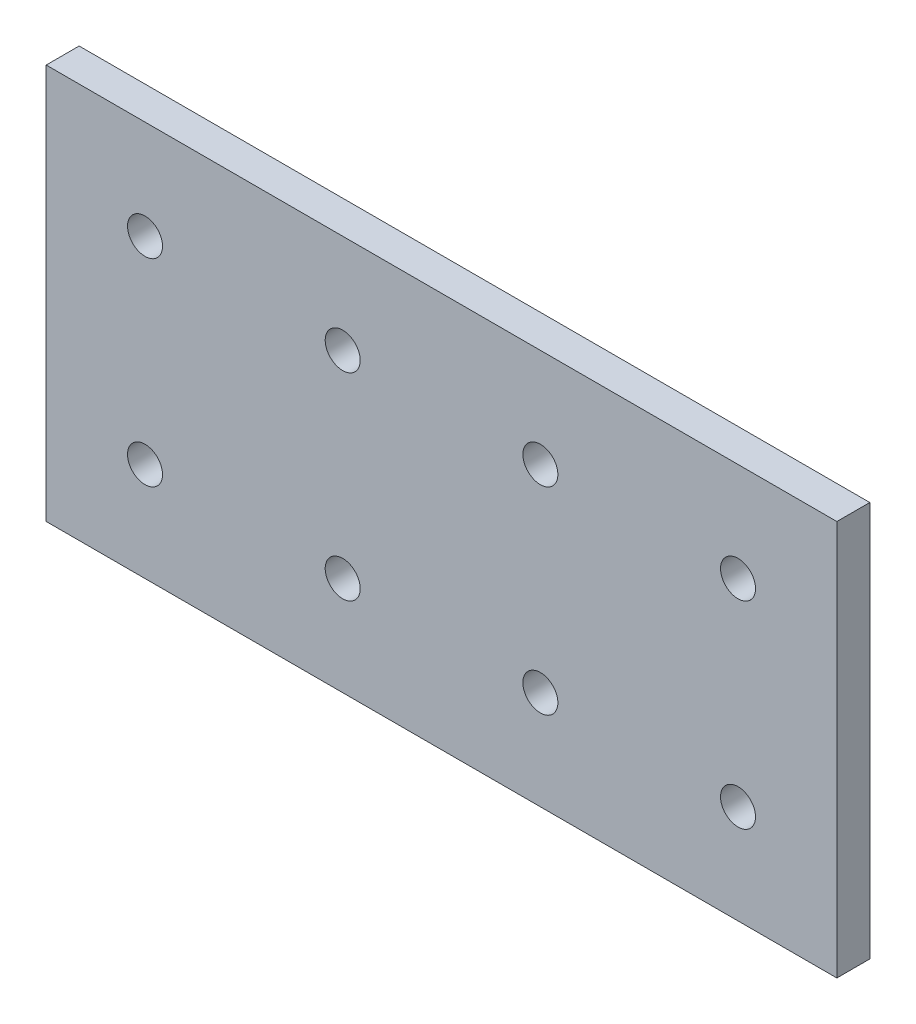
ISO-10303-21;
HEADER;
FILE_DESCRIPTION(('STEP AP214'),'2;1');
FILE_NAME('part.step','',(''),(''),'','','');
FILE_SCHEMA(('AUTOMOTIVE_DESIGN { 1 0 10303 214 1 1 1 1 }'));
ENDSEC;
DATA;
#1=APPLICATION_CONTEXT('core data for automotive mechanical design processes');
#2=APPLICATION_PROTOCOL_DEFINITION('international standard','automotive_design',2000,#1);
#3=PRODUCT_CONTEXT('',#1,'mechanical');
#4=PRODUCT('Part','Part','',(#3));
#5=PRODUCT_RELATED_PRODUCT_CATEGORY('part','',(#4));
#6=PRODUCT_DEFINITION_FORMATION('','',#4);
#7=PRODUCT_DEFINITION_CONTEXT('part definition',#1,'design');
#8=PRODUCT_DEFINITION('design','',#6,#7);
#9=PRODUCT_DEFINITION_SHAPE('','',#8);
#10=(LENGTH_UNIT() NAMED_UNIT(*) SI_UNIT(.MILLI.,.METRE.));
#11=(NAMED_UNIT(*) PLANE_ANGLE_UNIT() SI_UNIT($,.RADIAN.));
#12=(NAMED_UNIT(*) SI_UNIT($,.STERADIAN.) SOLID_ANGLE_UNIT());
#13=UNCERTAINTY_MEASURE_WITH_UNIT(LENGTH_MEASURE(1.E-05),#10,'distance_accuracy_value','');
#14=(GEOMETRIC_REPRESENTATION_CONTEXT(3) GLOBAL_UNCERTAINTY_ASSIGNED_CONTEXT((#13)) GLOBAL_UNIT_ASSIGNED_CONTEXT((#10,
#11,#12)) REPRESENTATION_CONTEXT('',''));
#15=CARTESIAN_POINT('',(0.,0.,0.));
#16=DIRECTION('',(0.,0.,1.));
#17=DIRECTION('',(1.,0.,0.));
#18=AXIS2_PLACEMENT_3D('',#15,#16,#17);
#19=CARTESIAN_POINT('',(133.35,57.15,6.35));
#20=DIRECTION('',(0.,0.,1.));
#21=DIRECTION('',(1.,0.,0.));
#22=AXIS2_PLACEMENT_3D('',#19,#20,#21);
#23=CYLINDRICAL_SURFACE('',#22,3.373501);
#24=CARTESIAN_POINT('',(133.35,57.15,0.));
#25=DIRECTION('',(0.,0.,1.));
#26=DIRECTION('',(1.,0.,0.));
#27=AXIS2_PLACEMENT_3D('',#24,#25,#26);
#28=CIRCLE('',#27,3.373501);
#29=CARTESIAN_POINT('',(136.723501,57.15,0.));
#30=VERTEX_POINT('',#29);
#31=EDGE_CURVE('E47',#30,#30,#28,.T.);
#32=ORIENTED_EDGE('',*,*,#31,.F.);
#33=EDGE_LOOP('',(#32));
#34=FACE_BOUND('',#33,.T.);
#35=CARTESIAN_POINT('',(133.35,57.15,6.35));
#36=DIRECTION('',(0.,0.,1.));
#37=DIRECTION('',(1.,0.,0.));
#38=AXIS2_PLACEMENT_3D('',#35,#36,#37);
#39=CIRCLE('',#38,3.373501);
#40=CARTESIAN_POINT('',(136.723501,57.15,6.35));
#41=VERTEX_POINT('',#40);
#42=EDGE_CURVE('E11',#41,#41,#39,.T.);
#43=ORIENTED_EDGE('',*,*,#42,.T.);
#44=EDGE_LOOP('',(#43));
#45=FACE_BOUND('',#44,.T.);
#46=ADVANCED_FACE('F39',(#34,#45),#23,.F.);
#47=CARTESIAN_POINT('',(95.25,57.15,6.35));
#48=DIRECTION('',(0.,0.,1.));
#49=DIRECTION('',(1.,0.,0.));
#50=AXIS2_PLACEMENT_3D('',#47,#48,#49);
#51=CYLINDRICAL_SURFACE('',#50,3.373501);
#52=CARTESIAN_POINT('',(95.25,57.15,0.));
#53=DIRECTION('',(0.,0.,1.));
#54=DIRECTION('',(1.,0.,0.));
#55=AXIS2_PLACEMENT_3D('',#52,#53,#54);
#56=CIRCLE('',#55,3.373501);
#57=CARTESIAN_POINT('',(98.623501,57.15,0.));
#58=VERTEX_POINT('',#57);
#59=EDGE_CURVE('E141',#58,#58,#56,.T.);
#60=ORIENTED_EDGE('',*,*,#59,.F.);
#61=EDGE_LOOP('',(#60));
#62=FACE_BOUND('',#61,.T.);
#63=CARTESIAN_POINT('',(95.25,57.15,6.35));
#64=DIRECTION('',(0.,0.,1.));
#65=DIRECTION('',(1.,0.,0.));
#66=AXIS2_PLACEMENT_3D('',#63,#64,#65);
#67=CIRCLE('',#66,3.373501);
#68=CARTESIAN_POINT('',(98.623501,57.15,6.35));
#69=VERTEX_POINT('',#68);
#70=EDGE_CURVE('E144',#69,#69,#67,.T.);
#71=ORIENTED_EDGE('',*,*,#70,.T.);
#72=EDGE_LOOP('',(#71));
#73=FACE_BOUND('',#72,.T.);
#74=ADVANCED_FACE('F153',(#62,#73),#51,.F.);
#75=CARTESIAN_POINT('',(57.15,57.15,6.35));
#76=DIRECTION('',(0.,0.,1.));
#77=DIRECTION('',(1.,0.,0.));
#78=AXIS2_PLACEMENT_3D('',#75,#76,#77);
#79=CYLINDRICAL_SURFACE('',#78,3.373501);
#80=CARTESIAN_POINT('',(57.15,57.15,0.));
#81=DIRECTION('',(0.,0.,1.));
#82=DIRECTION('',(1.,0.,0.));
#83=AXIS2_PLACEMENT_3D('',#80,#81,#82);
#84=CIRCLE('',#83,3.373501);
#85=CARTESIAN_POINT('',(60.523501,57.15,0.));
#86=VERTEX_POINT('',#85);
#87=EDGE_CURVE('E135',#86,#86,#84,.T.);
#88=ORIENTED_EDGE('',*,*,#87,.F.);
#89=EDGE_LOOP('',(#88));
#90=FACE_BOUND('',#89,.T.);
#91=CARTESIAN_POINT('',(57.15,57.15,6.35));
#92=DIRECTION('',(0.,0.,1.));
#93=DIRECTION('',(1.,0.,0.));
#94=AXIS2_PLACEMENT_3D('',#91,#92,#93);
#95=CIRCLE('',#94,3.373501);
#96=CARTESIAN_POINT('',(60.523501,57.15,6.35));
#97=VERTEX_POINT('',#96);
#98=EDGE_CURVE('E138',#97,#97,#95,.T.);
#99=ORIENTED_EDGE('',*,*,#98,.T.);
#100=EDGE_LOOP('',(#99));
#101=FACE_BOUND('',#100,.T.);
#102=ADVANCED_FACE('F192',(#90,#101),#79,.F.);
#103=CARTESIAN_POINT('',(19.05,57.15,6.35));
#104=DIRECTION('',(0.,0.,1.));
#105=DIRECTION('',(1.,0.,0.));
#106=AXIS2_PLACEMENT_3D('',#103,#104,#105);
#107=CYLINDRICAL_SURFACE('',#106,3.373501);
#108=CARTESIAN_POINT('',(19.05,57.15,0.));
#109=DIRECTION('',(0.,0.,1.));
#110=DIRECTION('',(1.,0.,0.));
#111=AXIS2_PLACEMENT_3D('',#108,#109,#110);
#112=CIRCLE('',#111,3.373501);
#113=CARTESIAN_POINT('',(22.423501,57.15,0.));
#114=VERTEX_POINT('',#113);
#115=EDGE_CURVE('E129',#114,#114,#112,.T.);
#116=ORIENTED_EDGE('',*,*,#115,.F.);
#117=EDGE_LOOP('',(#116));
#118=FACE_BOUND('',#117,.T.);
#119=CARTESIAN_POINT('',(19.05,57.15,6.35));
#120=DIRECTION('',(0.,0.,1.));
#121=DIRECTION('',(1.,0.,0.));
#122=AXIS2_PLACEMENT_3D('',#119,#120,#121);
#123=CIRCLE('',#122,3.373501);
#124=CARTESIAN_POINT('',(22.423501,57.15,6.35));
#125=VERTEX_POINT('',#124);
#126=EDGE_CURVE('E132',#125,#125,#123,.T.);
#127=ORIENTED_EDGE('',*,*,#126,.T.);
#128=EDGE_LOOP('',(#127));
#129=FACE_BOUND('',#128,.T.);
#130=ADVANCED_FACE('F188',(#118,#129),#107,.F.);
#131=CARTESIAN_POINT('',(133.35,19.05,6.35));
#132=DIRECTION('',(0.,0.,1.));
#133=DIRECTION('',(1.,0.,0.));
#134=AXIS2_PLACEMENT_3D('',#131,#132,#133);
#135=CYLINDRICAL_SURFACE('',#134,3.373501);
#136=CARTESIAN_POINT('',(133.35,19.05,0.));
#137=DIRECTION('',(0.,0.,1.));
#138=DIRECTION('',(1.,0.,0.));
#139=AXIS2_PLACEMENT_3D('',#136,#137,#138);
#140=CIRCLE('',#139,3.373501);
#141=CARTESIAN_POINT('',(136.723501,19.05,0.));
#142=VERTEX_POINT('',#141);
#143=EDGE_CURVE('E123',#142,#142,#140,.T.);
#144=ORIENTED_EDGE('',*,*,#143,.F.);
#145=EDGE_LOOP('',(#144));
#146=FACE_BOUND('',#145,.T.);
#147=CARTESIAN_POINT('',(133.35,19.05,6.35));
#148=DIRECTION('',(0.,0.,1.));
#149=DIRECTION('',(1.,0.,0.));
#150=AXIS2_PLACEMENT_3D('',#147,#148,#149);
#151=CIRCLE('',#150,3.373501);
#152=CARTESIAN_POINT('',(136.723501,19.05,6.35));
#153=VERTEX_POINT('',#152);
#154=EDGE_CURVE('E126',#153,#153,#151,.T.);
#155=ORIENTED_EDGE('',*,*,#154,.T.);
#156=EDGE_LOOP('',(#155));
#157=FACE_BOUND('',#156,.T.);
#158=ADVANCED_FACE('F184',(#146,#157),#135,.F.);
#159=CARTESIAN_POINT('',(95.25,19.05,6.35));
#160=DIRECTION('',(0.,0.,1.));
#161=DIRECTION('',(1.,0.,0.));
#162=AXIS2_PLACEMENT_3D('',#159,#160,#161);
#163=CYLINDRICAL_SURFACE('',#162,3.373501);
#164=CARTESIAN_POINT('',(95.25,19.05,0.));
#165=DIRECTION('',(0.,0.,1.));
#166=DIRECTION('',(1.,0.,0.));
#167=AXIS2_PLACEMENT_3D('',#164,#165,#166);
#168=CIRCLE('',#167,3.373501);
#169=CARTESIAN_POINT('',(98.623501,19.05,0.));
#170=VERTEX_POINT('',#169);
#171=EDGE_CURVE('E117',#170,#170,#168,.T.);
#172=ORIENTED_EDGE('',*,*,#171,.F.);
#173=EDGE_LOOP('',(#172));
#174=FACE_BOUND('',#173,.T.);
#175=CARTESIAN_POINT('',(95.25,19.05,6.35));
#176=DIRECTION('',(0.,0.,1.));
#177=DIRECTION('',(1.,0.,0.));
#178=AXIS2_PLACEMENT_3D('',#175,#176,#177);
#179=CIRCLE('',#178,3.373501);
#180=CARTESIAN_POINT('',(98.623501,19.05,6.35));
#181=VERTEX_POINT('',#180);
#182=EDGE_CURVE('E120',#181,#181,#179,.T.);
#183=ORIENTED_EDGE('',*,*,#182,.T.);
#184=EDGE_LOOP('',(#183));
#185=FACE_BOUND('',#184,.T.);
#186=ADVANCED_FACE('F181',(#174,#185),#163,.F.);
#187=CARTESIAN_POINT('',(0.,76.2,6.35));
#188=DIRECTION('',(1.,0.,0.));
#189=DIRECTION('',(0.,1.,0.));
#190=AXIS2_PLACEMENT_3D('',#187,#188,#189);
#191=PLANE('',#190);
#192=DIRECTION('',(0.,-1.,0.));
#193=VECTOR('',#192,1.);
#194=CARTESIAN_POINT('',(0.,76.2,0.));
#195=LINE('',#194,#193);
#196=CARTESIAN_POINT('',(0.,76.2,0.));
#197=VERTEX_POINT('',#196);
#198=CARTESIAN_POINT('',(0.,0.,0.));
#199=VERTEX_POINT('',#198);
#200=EDGE_CURVE('E107',#197,#199,#195,.T.);
#201=ORIENTED_EDGE('',*,*,#200,.T.);
#202=DIRECTION('',(0.,0.,-1.));
#203=VECTOR('',#202,1.);
#204=CARTESIAN_POINT('',(0.,0.,6.35));
#205=LINE('',#204,#203);
#206=CARTESIAN_POINT('',(0.,0.,6.35));
#207=VERTEX_POINT('',#206);
#208=EDGE_CURVE('E98',#207,#199,#205,.T.);
#209=ORIENTED_EDGE('',*,*,#208,.F.);
#210=DIRECTION('',(0.,-1.,0.));
#211=VECTOR('',#210,1.);
#212=CARTESIAN_POINT('',(0.,76.2,6.35));
#213=LINE('',#212,#211);
#214=CARTESIAN_POINT('',(0.,76.2,6.35));
#215=VERTEX_POINT('',#214);
#216=EDGE_CURVE('E92',#215,#207,#213,.T.);
#217=ORIENTED_EDGE('',*,*,#216,.F.);
#218=DIRECTION('',(0.,0.,-1.));
#219=VECTOR('',#218,1.);
#220=CARTESIAN_POINT('',(0.,76.2,6.35));
#221=LINE('',#220,#219);
#222=EDGE_CURVE('E103',#215,#197,#221,.T.);
#223=ORIENTED_EDGE('',*,*,#222,.T.);
#224=EDGE_LOOP('',(#201,#209,#217,#223));
#225=FACE_BOUND('',#224,.T.);
#226=ADVANCED_FACE('F178',(#225),#191,.F.);
#227=CARTESIAN_POINT('',(0.,0.,6.35));
#228=DIRECTION('',(0.,1.,0.));
#229=DIRECTION('',(0.,0.,1.));
#230=AXIS2_PLACEMENT_3D('',#227,#228,#229);
#231=PLANE('',#230);
#232=DIRECTION('',(1.,0.,0.));
#233=VECTOR('',#232,1.);
#234=CARTESIAN_POINT('',(0.,0.,0.));
#235=LINE('',#234,#233);
#236=CARTESIAN_POINT('',(152.4,0.,0.));
#237=VERTEX_POINT('',#236);
#238=EDGE_CURVE('E97',#199,#237,#235,.T.);
#239=ORIENTED_EDGE('',*,*,#238,.T.);
#240=DIRECTION('',(0.,0.,-1.));
#241=VECTOR('',#240,1.);
#242=CARTESIAN_POINT('',(152.4,0.,6.35));
#243=LINE('',#242,#241);
#244=CARTESIAN_POINT('',(152.4,0.,6.35));
#245=VERTEX_POINT('',#244);
#246=EDGE_CURVE('E95',#245,#237,#243,.T.);
#247=ORIENTED_EDGE('',*,*,#246,.F.);
#248=DIRECTION('',(1.,0.,0.));
#249=VECTOR('',#248,1.);
#250=CARTESIAN_POINT('',(0.,0.,6.35));
#251=LINE('',#250,#249);
#252=EDGE_CURVE('E86',#207,#245,#251,.T.);
#253=ORIENTED_EDGE('',*,*,#252,.F.);
#254=ORIENTED_EDGE('',*,*,#208,.T.);
#255=EDGE_LOOP('',(#239,#247,#253,#254));
#256=FACE_BOUND('',#255,.T.);
#257=ADVANCED_FACE('F96',(#256),#231,.F.);
#258=CARTESIAN_POINT('',(152.4,0.,6.35));
#259=DIRECTION('',(-1.,0.,0.));
#260=DIRECTION('',(0.,0.,1.));
#261=AXIS2_PLACEMENT_3D('',#258,#259,#260);
#262=PLANE('',#261);
#263=DIRECTION('',(0.,1.,0.));
#264=VECTOR('',#263,1.);
#265=CARTESIAN_POINT('',(152.4,0.,0.));
#266=LINE('',#265,#264);
#267=CARTESIAN_POINT('',(152.4,76.2,0.));
#268=VERTEX_POINT('',#267);
#269=EDGE_CURVE('E72',#237,#268,#266,.T.);
#270=ORIENTED_EDGE('',*,*,#269,.T.);
#271=DIRECTION('',(0.,0.,-1.));
#272=VECTOR('',#271,1.);
#273=CARTESIAN_POINT('',(152.4,76.2,6.35));
#274=LINE('',#273,#272);
#275=CARTESIAN_POINT('',(152.4,76.2,6.35));
#276=VERTEX_POINT('',#275);
#277=EDGE_CURVE('E99',#276,#268,#274,.T.);
#278=ORIENTED_EDGE('',*,*,#277,.F.);
#279=DIRECTION('',(0.,1.,0.));
#280=VECTOR('',#279,1.);
#281=CARTESIAN_POINT('',(152.4,0.,6.35));
#282=LINE('',#281,#280);
#283=EDGE_CURVE('E90',#245,#276,#282,.T.);
#284=ORIENTED_EDGE('',*,*,#283,.F.);
#285=ORIENTED_EDGE('',*,*,#246,.T.);
#286=EDGE_LOOP('',(#270,#278,#284,#285));
#287=FACE_BOUND('',#286,.T.);
#288=ADVANCED_FACE('F101',(#287),#262,.F.);
#289=CARTESIAN_POINT('',(152.4,76.2,6.35));
#290=DIRECTION('',(0.,-1.,0.));
#291=DIRECTION('',(1.,0.,0.));
#292=AXIS2_PLACEMENT_3D('',#289,#290,#291);
#293=PLANE('',#292);
#294=DIRECTION('',(-1.,0.,0.));
#295=VECTOR('',#294,1.);
#296=CARTESIAN_POINT('',(152.4,76.2,0.));
#297=LINE('',#296,#295);
#298=EDGE_CURVE('E78',#268,#197,#297,.T.);
#299=ORIENTED_EDGE('',*,*,#298,.T.);
#300=ORIENTED_EDGE('',*,*,#222,.F.);
#301=DIRECTION('',(-1.,0.,0.));
#302=VECTOR('',#301,1.);
#303=CARTESIAN_POINT('',(152.4,76.2,6.35));
#304=LINE('',#303,#302);
#305=EDGE_CURVE('E55',#276,#215,#304,.T.);
#306=ORIENTED_EDGE('',*,*,#305,.F.);
#307=ORIENTED_EDGE('',*,*,#277,.T.);
#308=EDGE_LOOP('',(#299,#300,#306,#307));
#309=FACE_BOUND('',#308,.T.);
#310=ADVANCED_FACE('F157',(#309),#293,.F.);
#311=CARTESIAN_POINT('',(0.,0.,6.35));
#312=DIRECTION('',(0.,0.,1.));
#313=DIRECTION('',(1.,0.,0.));
#314=AXIS2_PLACEMENT_3D('',#311,#312,#313);
#315=PLANE('',#314);
#316=CARTESIAN_POINT('',(57.15,19.05,6.35));
#317=DIRECTION('',(0.,0.,1.));
#318=DIRECTION('',(1.,0.,0.));
#319=AXIS2_PLACEMENT_3D('',#316,#317,#318);
#320=CIRCLE('',#319,3.373501);
#321=CARTESIAN_POINT('',(60.523501,19.05,6.35));
#322=VERTEX_POINT('',#321);
#323=EDGE_CURVE('E268',#322,#322,#320,.T.);
#324=ORIENTED_EDGE('',*,*,#323,.F.);
#325=EDGE_LOOP('',(#324));
#326=FACE_BOUND('',#325,.T.);
#327=CARTESIAN_POINT('',(19.05,19.05,6.35));
#328=DIRECTION('',(0.,0.,1.));
#329=DIRECTION('',(1.,0.,0.));
#330=AXIS2_PLACEMENT_3D('',#327,#328,#329);
#331=CIRCLE('',#330,3.373501);
#332=CARTESIAN_POINT('',(22.423501,19.05,6.35));
#333=VERTEX_POINT('',#332);
#334=EDGE_CURVE('E267',#333,#333,#331,.T.);
#335=ORIENTED_EDGE('',*,*,#334,.F.);
#336=EDGE_LOOP('',(#335));
#337=FACE_BOUND('',#336,.T.);
#338=ORIENTED_EDGE('',*,*,#216,.T.);
#339=ORIENTED_EDGE('',*,*,#252,.T.);
#340=ORIENTED_EDGE('',*,*,#283,.T.);
#341=ORIENTED_EDGE('',*,*,#305,.T.);
#342=EDGE_LOOP('',(#338,#339,#340,#341));
#343=FACE_BOUND('',#342,.T.);
#344=ORIENTED_EDGE('',*,*,#182,.F.);
#345=EDGE_LOOP('',(#344));
#346=FACE_BOUND('',#345,.T.);
#347=ORIENTED_EDGE('',*,*,#154,.F.);
#348=EDGE_LOOP('',(#347));
#349=FACE_BOUND('',#348,.T.);
#350=ORIENTED_EDGE('',*,*,#126,.F.);
#351=EDGE_LOOP('',(#350));
#352=FACE_BOUND('',#351,.T.);
#353=ORIENTED_EDGE('',*,*,#98,.F.);
#354=EDGE_LOOP('',(#353));
#355=FACE_BOUND('',#354,.T.);
#356=ORIENTED_EDGE('',*,*,#70,.F.);
#357=EDGE_LOOP('',(#356));
#358=FACE_BOUND('',#357,.T.);
#359=ORIENTED_EDGE('',*,*,#42,.F.);
#360=EDGE_LOOP('',(#359));
#361=FACE_BOUND('',#360,.T.);
#362=ADVANCED_FACE('F87',(#326,#337,#343,#346,#349,#352,#355,#358,#361),#315,.T.);
#363=CARTESIAN_POINT('',(0.,0.,0.));
#364=DIRECTION('',(0.,0.,1.));
#365=DIRECTION('',(1.,0.,0.));
#366=AXIS2_PLACEMENT_3D('',#363,#364,#365);
#367=PLANE('',#366);
#368=CARTESIAN_POINT('',(57.15,19.05,0.));
#369=DIRECTION('',(0.,0.,1.));
#370=DIRECTION('',(1.,0.,0.));
#371=AXIS2_PLACEMENT_3D('',#368,#369,#370);
#372=CIRCLE('',#371,3.373501);
#373=CARTESIAN_POINT('',(60.523501,19.05,0.));
#374=VERTEX_POINT('',#373);
#375=EDGE_CURVE('E272',#374,#374,#372,.T.);
#376=ORIENTED_EDGE('',*,*,#375,.T.);
#377=EDGE_LOOP('',(#376));
#378=FACE_BOUND('',#377,.T.);
#379=CARTESIAN_POINT('',(19.05,19.05,0.));
#380=DIRECTION('',(0.,0.,1.));
#381=DIRECTION('',(1.,0.,0.));
#382=AXIS2_PLACEMENT_3D('',#379,#380,#381);
#383=CIRCLE('',#382,3.373501);
#384=CARTESIAN_POINT('',(22.423501,19.05,0.));
#385=VERTEX_POINT('',#384);
#386=EDGE_CURVE('E110',#385,#385,#383,.T.);
#387=ORIENTED_EDGE('',*,*,#386,.T.);
#388=EDGE_LOOP('',(#387));
#389=FACE_BOUND('',#388,.T.);
#390=ORIENTED_EDGE('',*,*,#200,.F.);
#391=ORIENTED_EDGE('',*,*,#298,.F.);
#392=ORIENTED_EDGE('',*,*,#269,.F.);
#393=ORIENTED_EDGE('',*,*,#238,.F.);
#394=EDGE_LOOP('',(#390,#391,#392,#393));
#395=FACE_BOUND('',#394,.T.);
#396=ORIENTED_EDGE('',*,*,#171,.T.);
#397=EDGE_LOOP('',(#396));
#398=FACE_BOUND('',#397,.T.);
#399=ORIENTED_EDGE('',*,*,#143,.T.);
#400=EDGE_LOOP('',(#399));
#401=FACE_BOUND('',#400,.T.);
#402=ORIENTED_EDGE('',*,*,#115,.T.);
#403=EDGE_LOOP('',(#402));
#404=FACE_BOUND('',#403,.T.);
#405=ORIENTED_EDGE('',*,*,#87,.T.);
#406=EDGE_LOOP('',(#405));
#407=FACE_BOUND('',#406,.T.);
#408=ORIENTED_EDGE('',*,*,#59,.T.);
#409=EDGE_LOOP('',(#408));
#410=FACE_BOUND('',#409,.T.);
#411=ORIENTED_EDGE('',*,*,#31,.T.);
#412=EDGE_LOOP('',(#411));
#413=FACE_BOUND('',#412,.T.);
#414=ADVANCED_FACE('F149',(#378,#389,#395,#398,#401,#404,#407,#410,#413),#367,.F.);
#415=CARTESIAN_POINT('',(19.05,19.05,6.35));
#416=DIRECTION('',(0.,0.,1.));
#417=DIRECTION('',(1.,0.,0.));
#418=AXIS2_PLACEMENT_3D('',#415,#416,#417);
#419=CYLINDRICAL_SURFACE('',#418,3.373501);
#420=ORIENTED_EDGE('',*,*,#386,.F.);
#421=EDGE_LOOP('',(#420));
#422=FACE_BOUND('',#421,.T.);
#423=ORIENTED_EDGE('',*,*,#334,.T.);
#424=EDGE_LOOP('',(#423));
#425=FACE_BOUND('',#424,.T.);
#426=ADVANCED_FACE('F164',(#422,#425),#419,.F.);
#427=CARTESIAN_POINT('',(57.15,19.05,6.35));
#428=DIRECTION('',(0.,0.,1.));
#429=DIRECTION('',(1.,0.,0.));
#430=AXIS2_PLACEMENT_3D('',#427,#428,#429);
#431=CYLINDRICAL_SURFACE('',#430,3.373501);
#432=ORIENTED_EDGE('',*,*,#375,.F.);
#433=EDGE_LOOP('',(#432));
#434=FACE_BOUND('',#433,.T.);
#435=ORIENTED_EDGE('',*,*,#323,.T.);
#436=EDGE_LOOP('',(#435));
#437=FACE_BOUND('',#436,.T.);
#438=ADVANCED_FACE('F227',(#434,#437),#431,.F.);
#439=CLOSED_SHELL('',(#46,#74,#102,#130,#158,#186,#226,#257,#288,#310,#362,#414,#426,#438));
#440=MANIFOLD_SOLID_BREP('B2',#439);
#441=ADVANCED_BREP_SHAPE_REPRESENTATION('',(#18,#440),#14);
#442=SHAPE_DEFINITION_REPRESENTATION(#9,#441);
ENDSEC;
END-ISO-10303-21;
